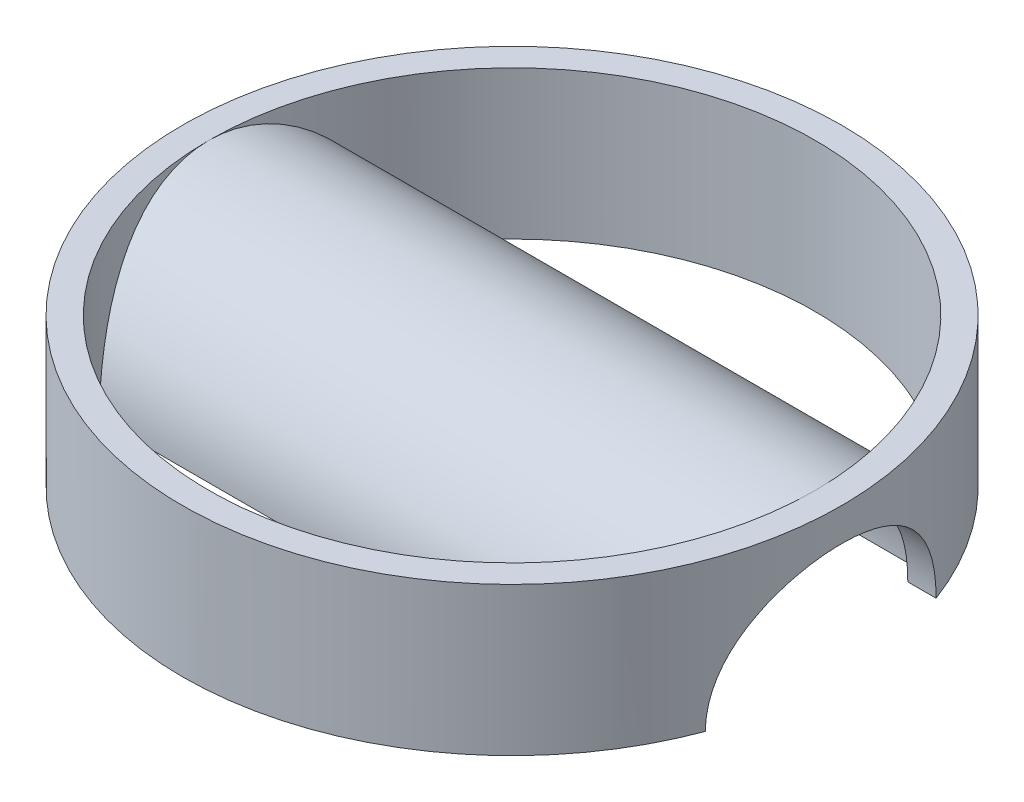
ISO-10303-21;
HEADER;
FILE_DESCRIPTION(('STEP AP214'),'2;1');
FILE_NAME('part.step','',(''),(''),'','','');
FILE_SCHEMA(('AUTOMOTIVE_DESIGN { 1 0 10303 214 1 1 1 1 }'));
ENDSEC;
DATA;
#1=APPLICATION_CONTEXT('core data for automotive mechanical design processes');
#2=APPLICATION_PROTOCOL_DEFINITION('international standard','automotive_design',2000,#1);
#3=PRODUCT_CONTEXT('',#1,'mechanical');
#4=PRODUCT('Part','Part','',(#3));
#5=PRODUCT_RELATED_PRODUCT_CATEGORY('part','',(#4));
#6=PRODUCT_DEFINITION_FORMATION('','',#4);
#7=PRODUCT_DEFINITION_CONTEXT('part definition',#1,'design');
#8=PRODUCT_DEFINITION('design','',#6,#7);
#9=PRODUCT_DEFINITION_SHAPE('','',#8);
#10=(LENGTH_UNIT() NAMED_UNIT(*) SI_UNIT(.MILLI.,.METRE.));
#11=(NAMED_UNIT(*) PLANE_ANGLE_UNIT() SI_UNIT($,.RADIAN.));
#12=(NAMED_UNIT(*) SI_UNIT($,.STERADIAN.) SOLID_ANGLE_UNIT());
#13=UNCERTAINTY_MEASURE_WITH_UNIT(LENGTH_MEASURE(1.E-05),#10,'distance_accuracy_value','');
#14=(GEOMETRIC_REPRESENTATION_CONTEXT(3) GLOBAL_UNCERTAINTY_ASSIGNED_CONTEXT((#13)) GLOBAL_UNIT_ASSIGNED_CONTEXT((#10,
#11,#12)) REPRESENTATION_CONTEXT('',''));
#15=CARTESIAN_POINT('',(0.,0.,0.));
#16=DIRECTION('',(0.,0.,1.));
#17=DIRECTION('',(1.,0.,0.));
#18=AXIS2_PLACEMENT_3D('',#15,#16,#17);
#19=CARTESIAN_POINT('',(0.,0.,0.));
#20=DIRECTION('',(0.,-1.,0.));
#21=DIRECTION('',(0.,0.,-1.));
#22=AXIS2_PLACEMENT_3D('',#19,#20,#21);
#23=PLANE('',#22);
#24=DIRECTION('',(1.,0.,0.));
#25=VECTOR('',#24,1.);
#26=CARTESIAN_POINT('',(0.,0.,2.25));
#27=LINE('',#26,#25);
#28=CARTESIAN_POINT('',(0.987831010538065,0.,2.25));
#29=VERTEX_POINT('',#28);
#30=CARTESIAN_POINT('',(9.01216898946194,0.,2.25));
#31=VERTEX_POINT('',#30);
#32=EDGE_CURVE('E237',#29,#31,#27,.T.);
#33=ORIENTED_EDGE('',*,*,#32,.F.);
#34=CARTESIAN_POINT('',(5.,0.,0.));
#35=DIRECTION('',(0.,-1.,0.));
#36=DIRECTION('',(0.,0.,-1.));
#37=AXIS2_PLACEMENT_3D('',#34,#35,#36);
#38=CIRCLE('',#37,4.6);
#39=EDGE_CURVE('E70',#31,#29,#38,.T.);
#40=ORIENTED_EDGE('',*,*,#39,.F.);
#41=EDGE_LOOP('',(#33,#40));
#42=FACE_BOUND('',#41,.T.);
#43=CARTESIAN_POINT('',(5.,0.,0.));
#44=DIRECTION('',(0.,-1.,0.));
#45=DIRECTION('',(0.,0.,-1.));
#46=AXIS2_PLACEMENT_3D('',#43,#44,#45);
#47=CIRCLE('',#46,5.);
#48=CARTESIAN_POINT('',(9.6837484987988,0.,1.75));
#49=VERTEX_POINT('',#48);
#50=CARTESIAN_POINT('',(0.3162515012012,0.,1.75));
#51=VERTEX_POINT('',#50);
#52=EDGE_CURVE('E126',#49,#51,#47,.T.);
#53=ORIENTED_EDGE('',*,*,#52,.T.);
#54=DIRECTION('',(-1.,0.,0.));
#55=VECTOR('',#54,1.);
#56=CARTESIAN_POINT('',(10.,0.,1.75));
#57=LINE('',#56,#55);
#58=CARTESIAN_POINT('',(0.745884345718842,0.,1.75));
#59=VERTEX_POINT('',#58);
#60=EDGE_CURVE('E162',#59,#51,#57,.T.);
#61=ORIENTED_EDGE('',*,*,#60,.F.);
#62=CARTESIAN_POINT('',(0.857536964558404,0.,2.));
#63=VERTEX_POINT('',#62);
#64=EDGE_CURVE('E158',#63,#59,#38,.T.);
#65=ORIENTED_EDGE('',*,*,#64,.F.);
#66=DIRECTION('',(-1.,0.,0.));
#67=VECTOR('',#66,1.);
#68=CARTESIAN_POINT('',(0.,0.,2.));
#69=LINE('',#68,#67);
#70=CARTESIAN_POINT('',(9.1424630354416,0.,2.));
#71=VERTEX_POINT('',#70);
#72=EDGE_CURVE('E265',#71,#63,#69,.T.);
#73=ORIENTED_EDGE('',*,*,#72,.F.);
#74=CARTESIAN_POINT('',(9.25411565428116,0.,1.75));
#75=VERTEX_POINT('',#74);
#76=EDGE_CURVE('E160',#75,#71,#38,.T.);
#77=ORIENTED_EDGE('',*,*,#76,.F.);
#78=EDGE_CURVE('E165',#49,#75,#57,.T.);
#79=ORIENTED_EDGE('',*,*,#78,.F.);
#80=EDGE_LOOP('',(#53,#61,#65,#73,#77,#79));
#81=FACE_BOUND('',#80,.T.);
#82=ADVANCED_FACE('F41',(#42,#81),#23,.T.);
#83=CARTESIAN_POINT('',(0.987831010538064,0.,-2.25));
#84=VERTEX_POINT('',#83);
#85=CARTESIAN_POINT('',(9.01216898946194,0.,-2.25));
#86=VERTEX_POINT('',#85);
#87=EDGE_CURVE('E159',#84,#86,#38,.T.);
#88=ORIENTED_EDGE('',*,*,#87,.F.);
#89=DIRECTION('',(1.,0.,0.));
#90=VECTOR('',#89,1.);
#91=CARTESIAN_POINT('',(0.,0.,-2.25));
#92=LINE('',#91,#90);
#93=EDGE_CURVE('E261',#84,#86,#92,.T.);
#94=ORIENTED_EDGE('',*,*,#93,.T.);
#95=EDGE_LOOP('',(#88,#94));
#96=FACE_BOUND('',#95,.T.);
#97=CARTESIAN_POINT('',(0.3162515012012,0.,-1.75));
#98=VERTEX_POINT('',#97);
#99=CARTESIAN_POINT('',(9.6837484987988,0.,-1.75));
#100=VERTEX_POINT('',#99);
#101=EDGE_CURVE('E124',#98,#100,#47,.T.);
#102=ORIENTED_EDGE('',*,*,#101,.T.);
#103=DIRECTION('',(-1.,0.,0.));
#104=VECTOR('',#103,1.);
#105=CARTESIAN_POINT('',(10.,0.,-1.75));
#106=LINE('',#105,#104);
#107=CARTESIAN_POINT('',(9.25411565428116,0.,-1.75));
#108=VERTEX_POINT('',#107);
#109=EDGE_CURVE('E133',#108,#100,#106,.F.);
#110=ORIENTED_EDGE('',*,*,#109,.F.);
#111=CARTESIAN_POINT('',(9.1424630354416,0.,-2.));
#112=VERTEX_POINT('',#111);
#113=EDGE_CURVE('E150',#112,#108,#38,.T.);
#114=ORIENTED_EDGE('',*,*,#113,.F.);
#115=DIRECTION('',(-1.,0.,0.));
#116=VECTOR('',#115,1.);
#117=CARTESIAN_POINT('',(0.,0.,-2.));
#118=LINE('',#117,#116);
#119=CARTESIAN_POINT('',(0.857536964558404,0.,-2.));
#120=VERTEX_POINT('',#119);
#121=EDGE_CURVE('E259',#112,#120,#118,.T.);
#122=ORIENTED_EDGE('',*,*,#121,.T.);
#123=CARTESIAN_POINT('',(0.745884345718842,0.,-1.75));
#124=VERTEX_POINT('',#123);
#125=EDGE_CURVE('E156',#124,#120,#38,.T.);
#126=ORIENTED_EDGE('',*,*,#125,.F.);
#127=EDGE_CURVE('E139',#98,#124,#106,.F.);
#128=ORIENTED_EDGE('',*,*,#127,.F.);
#129=EDGE_LOOP('',(#102,#110,#114,#122,#126,#128));
#130=FACE_BOUND('',#129,.T.);
#131=ADVANCED_FACE('F143',(#96,#130),#23,.T.);
#132=CARTESIAN_POINT('',(5.,2.25000000000002,0.));
#133=DIRECTION('',(0.,-1.,0.));
#134=DIRECTION('',(0.,0.,-1.));
#135=AXIS2_PLACEMENT_3D('',#132,#133,#134);
#136=CYLINDRICAL_SURFACE('',#135,4.6);
#137=ORIENTED_EDGE('',*,*,#87,.T.);
#138=CARTESIAN_POINT('',(9.01216898946194,0.,-2.25));
#139=CARTESIAN_POINT('',(9.01215226191571,0.0591193383603363,-2.25001042091816));
#140=CARTESIAN_POINT('',(9.01347524966883,0.118229418382301,-2.24767028754575));
#141=CARTESIAN_POINT('',(9.01867482733421,0.235938482673774,-2.23837085287397));
#142=CARTESIAN_POINT('',(9.02254992563146,0.294537745239158,-2.2314142497138));
#143=CARTESIAN_POINT('',(9.03270010210392,0.410482121911755,-2.21301451731746));
#144=CARTESIAN_POINT('',(9.03896182705205,0.467832370207593,-2.20159634188049));
#145=CARTESIAN_POINT('',(9.05365639005365,0.581200328382831,-2.17442129956309));
#146=CARTESIAN_POINT('',(9.06208946212052,0.637217893923238,-2.15866396502417));
#147=CARTESIAN_POINT('',(9.09020467906264,0.802501187165457,-2.10519751557872));
#148=CARTESIAN_POINT('',(9.11273477268241,0.909332933078639,-2.06123961045431));
#149=CARTESIAN_POINT('',(9.16280751266454,1.11417893658202,-1.9581384311416));
#150=CARTESIAN_POINT('',(9.19035755440456,1.21217986198981,-1.89897269929243));
#151=CARTESIAN_POINT('',(9.2499802568094,1.40494632765788,-1.76172776360235));
#152=CARTESIAN_POINT('',(9.28223808329457,1.49886193986463,-1.68253257833878));
#153=CARTESIAN_POINT('',(9.34613968950891,1.67271542726402,-1.50981718461198));
#154=CARTESIAN_POINT('',(9.37778330598169,1.7526496302453,-1.41629322476564));
#155=CARTESIAN_POINT('',(9.4393202700427,1.90129803894811,-1.21024948185522));
#156=CARTESIAN_POINT('',(9.46897233522057,1.96896803792398,-1.09689746100613));
#157=CARTESIAN_POINT('',(9.52078028545692,2.08388924581036,-0.858696533492306));
#158=CARTESIAN_POINT('',(9.5429406599695,2.13115268823275,-0.733854569540401));
#159=CARTESIAN_POINT('',(9.57592743140304,2.20056293760628,-0.485294244296741));
#160=CARTESIAN_POINT('',(9.58742701934264,2.22421024947974,-0.362086239526088));
#161=CARTESIAN_POINT('',(9.60030053914536,2.250645913304,-0.112953071646674));
#162=CARTESIAN_POINT('',(9.60168012911833,2.25344592103484,0.0129705336578172));
#163=CARTESIAN_POINT('',(9.59448785151615,2.23871481660233,0.252731499616454));
#164=CARTESIAN_POINT('',(9.58673543126909,2.22285798801819,0.366701816096554));
#165=CARTESIAN_POINT('',(9.56337338226351,2.17424234046734,0.590120373104213));
#166=CARTESIAN_POINT('',(9.54776331813399,2.14148258495224,0.699568362698115));
#167=CARTESIAN_POINT('',(9.50984709724638,2.05974421006981,0.912789003035313));
#168=CARTESIAN_POINT('',(9.48744856656678,2.01054081994078,1.01645838032306));
#169=CARTESIAN_POINT('',(9.43799774633117,1.89760348124523,1.2143280573401));
#170=CARTESIAN_POINT('',(9.41094369835941,1.83386403935843,1.30852475780742));
#171=CARTESIAN_POINT('',(9.35182841638748,1.68696115132252,1.49395575048974));
#172=CARTESIAN_POINT('',(9.31953553410854,1.60255483921451,1.58413239241832));
#173=CARTESIAN_POINT('',(9.25520063541857,1.42004344186009,1.74961919526835));
#174=CARTESIAN_POINT('',(9.22315884994185,1.32192702389467,1.82491693175759));
#175=CARTESIAN_POINT('',(9.16092332190671,1.10765480788556,1.96285101194141));
#176=CARTESIAN_POINT('',(9.130952499316,0.990773557722026,2.02446924266621));
#177=CARTESIAN_POINT('',(9.07930871301415,0.746577778835449,2.12662828219894));
#178=CARTESIAN_POINT('',(9.05761666065931,0.619288082975609,2.16721765623501));
#179=CARTESIAN_POINT('',(9.03218753484405,0.409039302224487,2.21401818021354));
#180=CARTESIAN_POINT('',(9.02474879870154,0.328079038133764,2.227459499189));
#181=CARTESIAN_POINT('',(9.01471032720756,0.1647731989111,2.24546982746328));
#182=CARTESIAN_POINT('',(9.01211733436697,0.082425854159989,2.250026474748));
#183=CARTESIAN_POINT('',(9.01216898946194,0.,2.25));
#184=B_SPLINE_CURVE_WITH_KNOTS('',3,(#138,#139,#140,#141,#142,#143,#144,#145,#146,#147,#148,
#149,#150,#151,#152,#153,#154,#155,#156,#157,#158,#159,#160,#161,#162,#163,#164,#165,#166,#167,
#168,#169,#170,#171,#172,#173,#174,#175,#176,#177,#178,#179,#180,#181,#182,#183),.UNSPECIFIED.,
.F.,.F.,(4,2,2,2,2,2,2,2,2,2,2,2,2,2,2,2,2,2,2,2,2,2,4),(0.,0.177281719720692,0.354459916620579,
0.530661013766885,0.706881108652787,1.05831031020711,1.41026148508282,1.78969011955156,
2.16921826163491,2.5730134903365,2.97656631087889,3.35243706269682,3.72809764844285,
4.07246324446721,4.41684792296692,4.76614693789848,5.11557817583227,5.49694692167357,
5.87863279101331,6.28299696075667,6.68642305885193,6.93305055626975,7.18002096372402),.UNSPECIFIED.);
#185=CARTESIAN_POINT('',(9.6,2.25000000000002,0.));
#186=VERTEX_POINT('',#185);
#187=EDGE_CURVE('E204',#86,#186,#184,.T.);
#188=ORIENTED_EDGE('',*,*,#187,.T.);
#189=CARTESIAN_POINT('',(5.,2.25000000000002,0.));
#190=DIRECTION('',(0.,-1.,0.));
#191=DIRECTION('',(0.,0.,-1.));
#192=AXIS2_PLACEMENT_3D('',#189,#190,#191);
#193=CIRCLE('',#192,4.6);
#194=CARTESIAN_POINT('',(0.399999999999999,2.25000000000002,0.));
#195=VERTEX_POINT('',#194);
#196=EDGE_CURVE('E246',#195,#186,#193,.T.);
#197=ORIENTED_EDGE('',*,*,#196,.F.);
#198=CARTESIAN_POINT('',(0.987831010538065,0.,2.25));
#199=CARTESIAN_POINT('',(0.987847738084289,0.0591193383603199,2.25001042091816));
#200=CARTESIAN_POINT('',(0.986524750331168,0.118229418382285,2.24767028754575));
#201=CARTESIAN_POINT('',(0.981325172665783,0.235938482673758,2.23837085287397));
#202=CARTESIAN_POINT('',(0.977450074368537,0.294537745239142,2.2314142497138));
#203=CARTESIAN_POINT('',(0.967299897896081,0.41048212191174,2.21301451731746));
#204=CARTESIAN_POINT('',(0.961038172947954,0.467832370207578,2.20159634188049));
#205=CARTESIAN_POINT('',(0.946343609946346,0.581200328382815,2.1744212995631));
#206=CARTESIAN_POINT('',(0.937910537879478,0.637217893923223,2.15866396502417));
#207=CARTESIAN_POINT('',(0.90979532093736,0.802501187165443,2.10519751557873));
#208=CARTESIAN_POINT('',(0.887265227317587,0.909332933078626,2.06123961045432));
#209=CARTESIAN_POINT('',(0.837192487335454,1.11417893658201,1.95813843114161));
#210=CARTESIAN_POINT('',(0.809642445595437,1.2121798619898,1.89897269929244));
#211=CARTESIAN_POINT('',(0.750019743190595,1.40494632765787,1.76172776360236));
#212=CARTESIAN_POINT('',(0.717761916705421,1.49886193986462,1.68253257833879));
#213=CARTESIAN_POINT('',(0.65386031049109,1.67271542726401,1.50981718461199));
#214=CARTESIAN_POINT('',(0.62221669401831,1.7526496302453,1.41629322476565));
#215=CARTESIAN_POINT('',(0.560679729957296,1.9012980389481,1.21024948185523));
#216=CARTESIAN_POINT('',(0.531027664779423,1.96896803792398,1.09689746100614));
#217=CARTESIAN_POINT('',(0.47921971454308,2.08388924581035,0.858696533492318));
#218=CARTESIAN_POINT('',(0.457059340030498,2.13115268823274,0.733854569540413));
#219=CARTESIAN_POINT('',(0.424072568596959,2.20056293760628,0.485294244296754));
#220=CARTESIAN_POINT('',(0.412572980657356,2.22421024947973,0.362086239526101));
#221=CARTESIAN_POINT('',(0.399699460854644,2.250645913304,0.112953071646687));
#222=CARTESIAN_POINT('',(0.398319870881667,2.25344592103484,-0.0129705336578033));
#223=CARTESIAN_POINT('',(0.40551214848385,2.23871481660234,-0.252731499616439));
#224=CARTESIAN_POINT('',(0.413264568730909,2.22285798801819,-0.36670181609654));
#225=CARTESIAN_POINT('',(0.436626617736495,2.17424234046734,-0.590120373104198));
#226=CARTESIAN_POINT('',(0.452236681866012,2.14148258495224,-0.699568362698101));
#227=CARTESIAN_POINT('',(0.490152902753628,2.05974421006981,-0.912789003035299));
#228=CARTESIAN_POINT('',(0.512551433433223,2.01054081994079,-1.01645838032304));
#229=CARTESIAN_POINT('',(0.56200225366883,1.89760348124524,-1.21432805734009));
#230=CARTESIAN_POINT('',(0.589056301640597,1.83386403935843,-1.30852475780741));
#231=CARTESIAN_POINT('',(0.648171583612529,1.68696115132253,-1.49395575048973));
#232=CARTESIAN_POINT('',(0.680464465891464,1.60255483921452,-1.58413239241831));
#233=CARTESIAN_POINT('',(0.744799364581429,1.4200434418601,-1.74961919526835));
#234=CARTESIAN_POINT('',(0.776841150058154,1.32192702389468,-1.82491693175758));
#235=CARTESIAN_POINT('',(0.839076678093291,1.10765480788557,-1.9628510119414));
#236=CARTESIAN_POINT('',(0.869047500684006,0.990773557722036,-2.0244692426662));
#237=CARTESIAN_POINT('',(0.920691286985848,0.746577778835461,-2.12662828219893));
#238=CARTESIAN_POINT('',(0.942383339340694,0.619288082975621,-2.167217656235));
#239=CARTESIAN_POINT('',(0.967812465155951,0.4090393022245,-2.21401818021354));
#240=CARTESIAN_POINT('',(0.975251201298464,0.328079038133777,-2.22745949918899));
#241=CARTESIAN_POINT('',(0.985289672792445,0.164773198911116,-2.24546982746327));
#242=CARTESIAN_POINT('',(0.987882665633029,0.0824258541600048,-2.250026474748));
#243=CARTESIAN_POINT('',(0.987831010538065,0.,-2.25));
#244=B_SPLINE_CURVE_WITH_KNOTS('',3,(#198,#199,#200,#201,#202,#203,#204,#205,#206,#207,#208,
#209,#210,#211,#212,#213,#214,#215,#216,#217,#218,#219,#220,#221,#222,#223,#224,#225,#226,#227,
#228,#229,#230,#231,#232,#233,#234,#235,#236,#237,#238,#239,#240,#241,#242,#243),.UNSPECIFIED.,
.F.,.F.,(4,2,2,2,2,2,2,2,2,2,2,2,2,2,2,2,2,2,2,2,2,2,4),(0.,0.177281719720692,0.35445991662058,
0.530661013766886,0.706881108652788,1.05831031020711,1.41026148508283,1.78969011955157,
2.16921826163492,2.5730134903365,2.9765663108789,3.35243706269682,3.72809764844286,
4.07246324446721,4.41684792296693,4.76614693789849,5.11557817583228,5.49694692167357,
5.87863279101332,6.28299696075667,6.68642305885193,6.93305055626975,7.18002096372402),.UNSPECIFIED.);
#245=EDGE_CURVE('E185',#195,#84,#244,.T.);
#246=ORIENTED_EDGE('',*,*,#245,.T.);
#247=EDGE_LOOP('',(#137,#188,#197,#246));
#248=FACE_BOUND('',#247,.T.);
#249=ADVANCED_FACE('F176',(#248),#136,.F.);
#250=EDGE_CURVE('E140',#186,#195,#193,.T.);
#251=ORIENTED_EDGE('',*,*,#250,.F.);
#252=EDGE_CURVE('E193',#186,#31,#184,.T.);
#253=ORIENTED_EDGE('',*,*,#252,.T.);
#254=ORIENTED_EDGE('',*,*,#39,.T.);
#255=EDGE_CURVE('E274',#29,#195,#244,.T.);
#256=ORIENTED_EDGE('',*,*,#255,.T.);
#257=EDGE_LOOP('',(#251,#253,#254,#256));
#258=FACE_BOUND('',#257,.T.);
#259=ADVANCED_FACE('F285',(#258),#136,.F.);
#260=ORIENTED_EDGE('',*,*,#76,.T.);
#261=CARTESIAN_POINT('',(9.1424630354416,0.,2.));
#262=CARTESIAN_POINT('',(9.14246806311185,0.106175152213515,1.99999530311751));
#263=CARTESIAN_POINT('',(9.14660399038578,0.212528347322527,1.99149155896143));
#264=CARTESIAN_POINT('',(9.1625946322044,0.422122789743843,1.9578397975293));
#265=CARTESIAN_POINT('',(9.17446942285977,0.525355210271091,1.93264848666684));
#266=CARTESIAN_POINT('',(9.20432179483748,0.725301560364742,1.86680645653016));
#267=CARTESIAN_POINT('',(9.22227295888263,0.822041570479978,1.82622256661147));
#268=CARTESIAN_POINT('',(9.2622153266006,1.00731390119094,1.7309474538946));
#269=CARTESIAN_POINT('',(9.28420582327564,1.09584765404063,1.67625869917197));
#270=CARTESIAN_POINT('',(9.33141707323708,1.26825540374419,1.55035828339539));
#271=CARTESIAN_POINT('',(9.35675336954986,1.35150630903776,1.47833626573371));
#272=CARTESIAN_POINT('',(9.40685593818728,1.50521350665962,1.32151228350938));
#273=CARTESIAN_POINT('',(9.4316219755083,1.57566460377287,1.23670515513727));
#274=CARTESIAN_POINT('',(9.4792194065118,1.70505218211538,1.05172759931953));
#275=CARTESIAN_POINT('',(9.50190100959082,1.76327420725275,0.951015352407976));
#276=CARTESIAN_POINT('',(9.5413431504715,1.86167612729061,0.740059775682963));
#277=CARTESIAN_POINT('',(9.55810653773684,1.9018647073487,0.629821064521891));
#278=CARTESIAN_POINT('',(9.58300166972325,1.96075896869638,0.409496803187521));
#279=CARTESIAN_POINT('',(9.59156466456272,1.98054278763174,0.299749194225163));
#280=CARTESIAN_POINT('',(9.60066949767696,2.00156329924627,0.0781808581979216));
#281=CARTESIAN_POINT('',(9.60121489788946,2.00280822811106,-0.0336389261626699));
#282=CARTESIAN_POINT('',(9.5944672205797,1.98725081151937,-0.248285618766573));
#283=CARTESIAN_POINT('',(9.5876903357199,1.97163699288649,-0.351218054474396));
#284=CARTESIAN_POINT('',(9.56778311284747,1.92486067378227,-0.552831686497816));
#285=CARTESIAN_POINT('',(9.55465230486356,1.8936970231541,-0.651512567756874));
#286=CARTESIAN_POINT('',(9.52303970517703,1.8163558594895,-0.843649712167159));
#287=CARTESIAN_POINT('',(9.5044791349828,1.76995597993599,-0.937002968050662));
#288=CARTESIAN_POINT('',(9.46379406341641,1.6636899188872,-1.11484396784575));
#289=CARTESIAN_POINT('',(9.44166827390979,1.60381886706833,-1.19932848914277));
#290=CARTESIAN_POINT('',(9.39406568656005,1.4670468368057,-1.36384233103048));
#291=CARTESIAN_POINT('',(9.36846200903427,1.38919920246959,-1.44304899634184));
#292=CARTESIAN_POINT('',(9.31801099850211,1.22132053480878,-1.58765829853272));
#293=CARTESIAN_POINT('',(9.29316401544564,1.13128396619108,-1.65305462905923));
#294=CARTESIAN_POINT('',(9.24608617223059,0.937243279459384,-1.77057103743728));
#295=CARTESIAN_POINT('',(9.22399260864159,0.832835261679365,-1.82208407125543));
#296=CARTESIAN_POINT('',(9.18659620049954,0.615613619088706,-1.90645396367255));
#297=CARTESIAN_POINT('',(9.17128800391885,0.502806701325285,-1.93932553165755));
#298=CARTESIAN_POINT('',(9.15055797118611,0.280253667320439,-1.98328606053446));
#299=CARTESIAN_POINT('',(9.14452865477185,0.170830546976165,-1.99571753476307));
#300=CARTESIAN_POINT('',(9.1412978270933,-0.0486810363801587,-2.00241696852022));
#301=CARTESIAN_POINT('',(9.14409277950984,-0.15876921522159,-1.99669220414372));
#302=CARTESIAN_POINT('',(9.15756357519993,-0.368065014525704,-1.96846936433846));
#303=CARTESIAN_POINT('',(9.16765401027538,-0.467483220869257,-1.94721606948348));
#304=CARTESIAN_POINT('',(9.19380633698488,-0.661241340001427,-1.89022850580754));
#305=CARTESIAN_POINT('',(9.20986970947324,-0.755579986782782,-1.85449064566934));
#306=CARTESIAN_POINT('',(9.24701438959494,-0.941153712506054,-1.7678172591703));
#307=CARTESIAN_POINT('',(9.2682854220213,-1.03206948618006,-1.71628210917469));
#308=CARTESIAN_POINT('',(9.31320051172397,-1.20442349242039,-1.60005610718941));
#309=CARTESIAN_POINT('',(9.33684565389904,-1.28585735498398,-1.53535922668905));
#310=CARTESIAN_POINT('',(9.38641453751167,-1.44458430839867,-1.38778544546639));
#311=CARTESIAN_POINT('',(9.412351577144,-1.52084274040164,-1.30379556353977));
#312=CARTESIAN_POINT('',(9.46163111575775,-1.65839755167602,-1.1236374767173));
#313=CARTESIAN_POINT('',(9.48497331484138,-1.71969220249078,-1.02746786689572));
#314=CARTESIAN_POINT('',(9.52668606891059,-1.82572808428391,-0.824556805603411));
#315=CARTESIAN_POINT('',(9.54502456017467,-1.87036320165056,-0.717752895895001));
#316=CARTESIAN_POINT('',(9.57440691925551,-1.94067740282899,-0.497141971275311));
#317=CARTESIAN_POINT('',(9.58545555685257,-1.96636888283445,-0.383339588894902));
#318=CARTESIAN_POINT('',(9.59842090409752,-1.99640651243888,-0.161165899464224));
#319=CARTESIAN_POINT('',(9.6009597548307,-2.00220763164285,-0.0530264590520763));
#320=CARTESIAN_POINT('',(9.59838690965581,-1.99628946756613,0.16266655316553));
#321=CARTESIAN_POINT('',(9.59327677594966,-1.98457376186126,0.270220240100884));
#322=CARTESIAN_POINT('',(9.57632104483087,-1.9449968805077,0.477103829793295));
#323=CARTESIAN_POINT('',(9.56476116544688,-1.91781969173782,0.576590026892768));
#324=CARTESIAN_POINT('',(9.53622577190859,-1.84887159271505,0.769529124527719));
#325=CARTESIAN_POINT('',(9.51924927885239,-1.80709804444721,0.86298093084192));
#326=CARTESIAN_POINT('',(9.4805339659563,-1.70802676308519,1.04592438264821));
#327=CARTESIAN_POINT('',(9.45861277599899,-1.65010613644357,1.13503914687413));
#328=CARTESIAN_POINT('',(9.4125515914946,-1.52125906349677,1.30267346461881));
#329=CARTESIAN_POINT('',(9.38841069556962,-1.450327321903,1.38118868164606));
#330=CARTESIAN_POINT('',(9.33833207570661,-1.29121761594745,1.53154092060296));
#331=CARTESIAN_POINT('',(9.31239544526379,-1.20214494776314,1.60243479209411));
#332=CARTESIAN_POINT('',(9.26345442459961,-1.01262388146713,1.72845083012102));
#333=CARTESIAN_POINT('',(9.24045178937292,-0.912168742034061,1.7835635813498));
#334=CARTESIAN_POINT('',(9.2003086349293,-0.702277458400498,1.87615819336783));
#335=CARTESIAN_POINT('',(9.18316978114197,-0.592838773620883,1.91363504634684));
#336=CARTESIAN_POINT('',(9.15733137372799,-0.368389705616246,1.96915264800439));
#337=CARTESIAN_POINT('',(9.14860351848983,-0.253399384211109,1.98725859936658));
#338=CARTESIAN_POINT('',(9.14399025971766,-0.114851615365163,1.9968329987511));
#339=CARTESIAN_POINT('',(9.14341870676231,-0.0919035207137795,1.99801951623504));
#340=CARTESIAN_POINT('',(9.14265454646599,-0.0459730671700044,1.99960353334146));
#341=CARTESIAN_POINT('',(9.14246194677166,-0.0229907075955698,2.00000101704259));
#342=CARTESIAN_POINT('',(9.1424630354416,0.,2.));
#343=B_SPLINE_CURVE_WITH_KNOTS('',3,(#261,#262,#263,#264,#265,#266,#267,#268,#269,#270,#271,
#272,#273,#274,#275,#276,#277,#278,#279,#280,#281,#282,#283,#284,#285,#286,#287,#288,#289,#290,
#291,#292,#293,#294,#295,#296,#297,#298,#299,#300,#301,#302,#303,#304,#305,#306,#307,#308,#309,
#310,#311,#312,#313,#314,#315,#316,#317,#318,#319,#320,#321,#322,#323,#324,#325,#326,#327,#328,
#329,#330,#331,#332,#333,#334,#335,#336,#337,#338,#339,#340,#341,#342),.UNSPECIFIED.,.T.,.F.,(4,
2,2,2,2,2,2,2,2,2,2,2,2,2,2,2,2,2,2,2,2,2,2,2,2,2,2,2,2,2,2,2,2,2,2,2,2,2,2,2,4),(0.,
0.318428625191217,0.637686621936556,0.955574088029287,1.27340596772481,1.61081841354016,
1.94836750461647,2.30210852036036,2.6556789861809,2.98942604364586,3.32302482444764,
3.63455329960704,3.94610482065709,4.26242196146309,4.57885364681527,4.91926230039246,
5.25982606369487,5.61348245749554,5.96685940263917,6.29593495556254,6.62487864844418,
6.92999962305467,7.23519629598215,7.55382453000134,7.87259903627943,8.22010350106513,
8.56764808689365,8.91737005174371,9.26686296459848,9.59017219018092,9.91341539322313,
10.2233616288063,10.5333639102877,10.8575513589945,11.1818710400522,11.5305259020817,
11.8793883466613,12.2283497929636,12.576132899237,12.6450826632875,12.7140338186116),.UNSPECIFIED.);
#344=EDGE_CURVE('E146',#71,#112,#343,.T.);
#345=ORIENTED_EDGE('',*,*,#344,.T.);
#346=ORIENTED_EDGE('',*,*,#113,.T.);
#347=CARTESIAN_POINT('',(9.25411565428116,0.,-1.75));
#348=CARTESIAN_POINT('',(9.25410992287369,0.0473019743762563,-1.75000180814593));
#349=CARTESIAN_POINT('',(9.25490558283974,0.0945792475449949,-1.7480809235611));
#350=CARTESIAN_POINT('',(9.25804217343128,0.18875711047749,-1.74043172627651));
#351=CARTESIAN_POINT('',(9.26038257065395,0.235657824612073,-1.73470472783556));
#352=CARTESIAN_POINT('',(9.269607776033,0.37493488988312,-1.71193790226351));
#353=CARTESIAN_POINT('',(9.27869763509534,0.46631695227543,-1.68931143853315));
#354=CARTESIAN_POINT('',(9.30162397394134,0.643601449706651,-1.63003806317024));
#355=CARTESIAN_POINT('',(9.31545625709267,0.729508650085148,-1.59340354415402));
#356=CARTESIAN_POINT('',(9.34629557692409,0.894050664311445,-1.50725044448465));
#357=CARTESIAN_POINT('',(9.3633052978843,0.972679244606584,-1.45772095620734));
#358=CARTESIAN_POINT('',(9.39954768401237,1.12436733739075,-1.34449496972005));
#359=CARTESIAN_POINT('',(9.41884679709259,1.19700066155125,-1.2802488750058));
#360=CARTESIAN_POINT('',(9.45694032631125,1.33076456720752,-1.14057803936638));
#361=CARTESIAN_POINT('',(9.47573464293148,1.39189289461178,-1.06515111302495));
#362=CARTESIAN_POINT('',(9.51149900156477,1.50299437682344,-0.901988679150384));
#363=CARTESIAN_POINT('',(9.52838156767409,1.55249925422428,-0.813913423186256));
#364=CARTESIAN_POINT('',(9.55761390491121,1.63580965770043,-0.629930851531691));
#365=CARTESIAN_POINT('',(9.56996540834298,1.66962118493015,-0.53402654620266));
#366=CARTESIAN_POINT('',(9.58827016749172,1.71907766154115,-0.341610566472286));
#367=CARTESIAN_POINT('',(9.59448242297448,1.73546045516269,-0.245313661631263));
#368=CARTESIAN_POINT('',(9.600739711171,1.75196124192706,-0.0511486653056569));
#369=CARTESIAN_POINT('',(9.60078670178377,1.7520843986319,0.0467189175054196));
#370=CARTESIAN_POINT('',(9.59487114268516,1.73648608360848,0.235946705608964));
#371=CARTESIAN_POINT('',(9.58921433296575,1.72157072146491,0.327384593837916));
#372=CARTESIAN_POINT('',(9.57293027285103,1.67767828044786,0.506345712265975));
#373=CARTESIAN_POINT('',(9.56230274017342,1.64870040297493,0.59386871983368));
#374=CARTESIAN_POINT('',(9.53693181279757,1.57714360687683,0.764045980330548));
#375=CARTESIAN_POINT('',(9.52213023687997,1.53437110008071,0.846609799509263));
#376=CARTESIAN_POINT('',(9.48990287248052,1.43661203015296,1.00359539017313));
#377=CARTESIAN_POINT('',(9.47247621528079,1.38162142081379,1.07801445218585));
#378=CARTESIAN_POINT('',(9.43555530040169,1.2571353003525,1.22133185256725));
#379=CARTESIAN_POINT('',(9.41599972206181,1.18696766547039,1.28963141193855));
#380=CARTESIAN_POINT('',(9.37785132513865,1.03605195005326,1.4137338594285));
#381=CARTESIAN_POINT('',(9.35925889901238,0.95529960313389,1.46953168376452));
#382=CARTESIAN_POINT('',(9.32474262259859,0.783057680793006,1.56825032015716));
#383=CARTESIAN_POINT('',(9.30889328545735,0.691357391875872,1.61083100121302));
#384=CARTESIAN_POINT('',(9.28253290966555,0.501372358841491,1.67966985119265));
#385=CARTESIAN_POINT('',(9.27201281165672,0.403099112538325,1.70595573734095));
#386=CARTESIAN_POINT('',(9.26134932571395,0.253187024663225,1.73233442255356));
#387=CARTESIAN_POINT('',(9.25864760239432,0.202797541249276,1.73895229673954));
#388=CARTESIAN_POINT('',(9.25502770509509,0.101615376057461,1.74778439807952));
#389=CARTESIAN_POINT('',(9.25410798245756,0.0508230829301556,1.75000244896513));
#390=CARTESIAN_POINT('',(9.25411565428116,0.,1.75));
#391=B_SPLINE_CURVE_WITH_KNOTS('',3,(#347,#348,#349,#350,#351,#352,#353,#354,#355,#356,#357,
#358,#359,#360,#361,#362,#363,#364,#365,#366,#367,#368,#369,#370,#371,#372,#373,#374,#375,#376,
#377,#378,#379,#380,#381,#382,#383,#384,#385,#386,#387,#388,#389,#390),.UNSPECIFIED.,.F.,.F.,(4,
2,2,2,2,2,2,2,2,2,2,2,2,2,2,2,2,2,2,2,2,4),(0.,0.1418123252954,0.283575707932379,
0.565827632132784,0.847830429876812,1.1300725481882,1.42537775790837,1.72074076456962,
2.02649815851778,2.33213853397464,2.62425073232596,2.91627016457895,3.19342696840398,
3.47059951359327,3.7518446406576,4.03318304544681,4.33139449096918,4.62972650847034,
4.93519822051994,5.24014889324013,5.39263457102136,5.54498767070493),.UNSPECIFIED.);
#392=EDGE_CURVE('E55',#108,#75,#391,.T.);
#393=ORIENTED_EDGE('',*,*,#392,.T.);
#394=EDGE_LOOP('',(#260,#345,#346,#393));
#395=FACE_BOUND('',#394,.T.);
#396=ADVANCED_FACE('F175',(#395),#136,.F.);
#397=ORIENTED_EDGE('',*,*,#125,.T.);
#398=CARTESIAN_POINT('',(0.857536964558403,0.,2.));
#399=CARTESIAN_POINT('',(0.857531936888153,-0.106175152213515,1.99999530311751));
#400=CARTESIAN_POINT('',(0.853396009614222,-0.212528347322526,1.99149155896143));
#401=CARTESIAN_POINT('',(0.837405367795608,-0.422122789743842,1.95783979752931));
#402=CARTESIAN_POINT('',(0.825530577140239,-0.525355210271089,1.93264848666684));
#403=CARTESIAN_POINT('',(0.79567820516252,-0.72530156036474,1.86680645653017));
#404=CARTESIAN_POINT('',(0.777727041117377,-0.822041570479976,1.82622256661147));
#405=CARTESIAN_POINT('',(0.73778467339941,-1.00731390119094,1.7309474538946));
#406=CARTESIAN_POINT('',(0.715794176724364,-1.09584765404063,1.67625869917197));
#407=CARTESIAN_POINT('',(0.66858292676293,-1.26825540374419,1.55035828339539));
#408=CARTESIAN_POINT('',(0.643246630450153,-1.35150630903776,1.47833626573371));
#409=CARTESIAN_POINT('',(0.593144061812726,-1.50521350665962,1.32151228350939));
#410=CARTESIAN_POINT('',(0.56837802449171,-1.57566460377287,1.23670515513727));
#411=CARTESIAN_POINT('',(0.520780593488207,-1.70505218211537,1.05172759931954));
#412=CARTESIAN_POINT('',(0.498098990409189,-1.76327420725274,0.951015352407983));
#413=CARTESIAN_POINT('',(0.458656849528507,-1.86167612729061,0.740059775682971));
#414=CARTESIAN_POINT('',(0.441893462263166,-1.9018647073487,0.629821064521899));
#415=CARTESIAN_POINT('',(0.416998330276758,-1.96075896869637,0.409496803187529));
#416=CARTESIAN_POINT('',(0.408435335437281,-1.98054278763174,0.299749194225171));
#417=CARTESIAN_POINT('',(0.399330502323035,-2.00156329924627,0.0781808581979277));
#418=CARTESIAN_POINT('',(0.398785102110544,-2.00280822811106,-0.0336389261626642));
#419=CARTESIAN_POINT('',(0.4055327794203,-1.98725081151937,-0.248285618766568));
#420=CARTESIAN_POINT('',(0.4123096642801,-1.97163699288649,-0.351218054474391));
#421=CARTESIAN_POINT('',(0.432216887152531,-1.92486067378227,-0.552831686497812));
#422=CARTESIAN_POINT('',(0.445347695136431,-1.8936970231541,-0.65151256775687));
#423=CARTESIAN_POINT('',(0.476960294822964,-1.8163558594895,-0.843649712167156));
#424=CARTESIAN_POINT('',(0.49552086501719,-1.76995597993599,-0.937002968050658));
#425=CARTESIAN_POINT('',(0.536205936583583,-1.66368991888721,-1.11484396784575));
#426=CARTESIAN_POINT('',(0.558331726090208,-1.60381886706833,-1.19932848914276));
#427=CARTESIAN_POINT('',(0.605934313439941,-1.46704683680571,-1.36384233103048));
#428=CARTESIAN_POINT('',(0.631537990965723,-1.3891992024696,-1.44304899634184));
#429=CARTESIAN_POINT('',(0.681989001497886,-1.22132053480879,-1.58765829853272));
#430=CARTESIAN_POINT('',(0.706835984554352,-1.13128396619108,-1.65305462905922));
#431=CARTESIAN_POINT('',(0.753913827769406,-0.937243279459391,-1.77057103743728));
#432=CARTESIAN_POINT('',(0.776007391358399,-0.832835261679371,-1.82208407125542));
#433=CARTESIAN_POINT('',(0.813403799500454,-0.615613619088713,-1.90645396367255));
#434=CARTESIAN_POINT('',(0.82871199608115,-0.502806701325293,-1.93932553165755));
#435=CARTESIAN_POINT('',(0.849442028813886,-0.280253667320446,-1.98328606053446));
#436=CARTESIAN_POINT('',(0.855471345228151,-0.170830546976172,-1.99571753476307));
#437=CARTESIAN_POINT('',(0.8587021729067,0.0486810363801541,-2.00241696852022));
#438=CARTESIAN_POINT('',(0.855907220490164,0.158769215221586,-1.99669220414372));
#439=CARTESIAN_POINT('',(0.842436424800072,0.368065014525701,-1.96846936433846));
#440=CARTESIAN_POINT('',(0.832345989724621,0.467483220869254,-1.94721606948348));
#441=CARTESIAN_POINT('',(0.806193663015125,0.661241340001425,-1.89022850580754));
#442=CARTESIAN_POINT('',(0.790130290526766,0.755579986782779,-1.85449064566934));
#443=CARTESIAN_POINT('',(0.752985610405066,0.941153712506051,-1.7678172591703));
#444=CARTESIAN_POINT('',(0.731714577978704,1.03206948618006,-1.71628210917469));
#445=CARTESIAN_POINT('',(0.686799488276036,1.20442349242038,-1.60005610718941));
#446=CARTESIAN_POINT('',(0.663154346100969,1.28585735498398,-1.53535922668906));
#447=CARTESIAN_POINT('',(0.613585462488332,1.44458430839866,-1.38778544546639));
#448=CARTESIAN_POINT('',(0.587648422856003,1.52084274040164,-1.30379556353977));
#449=CARTESIAN_POINT('',(0.538368884242258,1.65839755167602,-1.1236374767173));
#450=CARTESIAN_POINT('',(0.51502668515863,1.71969220249078,-1.02746786689572));
#451=CARTESIAN_POINT('',(0.47331393108942,1.82572808428391,-0.824556805603418));
#452=CARTESIAN_POINT('',(0.454975439825333,1.87036320165055,-0.717752895895008));
#453=CARTESIAN_POINT('',(0.42559308074449,1.94067740282899,-0.497141971275318));
#454=CARTESIAN_POINT('',(0.414544443147429,1.96636888283445,-0.383339588894908));
#455=CARTESIAN_POINT('',(0.401579095902481,1.99640651243888,-0.16116589946423));
#456=CARTESIAN_POINT('',(0.399040245169301,2.00220763164285,-0.0530264590520824));
#457=CARTESIAN_POINT('',(0.401613090344191,1.99628946756613,0.162666553165525));
#458=CARTESIAN_POINT('',(0.406723224050338,1.98457376186126,0.270220240100879));
#459=CARTESIAN_POINT('',(0.423678955169122,1.9449968805077,0.477103829793291));
#460=CARTESIAN_POINT('',(0.435238834553119,1.91781969173782,0.576590026892764));
#461=CARTESIAN_POINT('',(0.463774228091407,1.84887159271505,0.769529124527715));
#462=CARTESIAN_POINT('',(0.480750721147608,1.80709804444721,0.862980930841917));
#463=CARTESIAN_POINT('',(0.519466034043696,1.7080267630852,1.04592438264821));
#464=CARTESIAN_POINT('',(0.541387224001008,1.65010613644357,1.13503914687413));
#465=CARTESIAN_POINT('',(0.587448408505391,1.52125906349677,1.30267346461881));
#466=CARTESIAN_POINT('',(0.611589304430371,1.45032732190301,1.38118868164606));
#467=CARTESIAN_POINT('',(0.661667924293384,1.29121761594746,1.53154092060296));
#468=CARTESIAN_POINT('',(0.687604554736199,1.20214494776315,1.6024347920941));
#469=CARTESIAN_POINT('',(0.736545575400385,1.01262388146713,1.72845083012102));
#470=CARTESIAN_POINT('',(0.759548210627069,0.912168742034068,1.7835635813498));
#471=CARTESIAN_POINT('',(0.799691365070694,0.702277458400506,1.87615819336783));
#472=CARTESIAN_POINT('',(0.816830218858022,0.592838773620891,1.91363504634683));
#473=CARTESIAN_POINT('',(0.842668626272004,0.368389705616254,1.96915264800439));
#474=CARTESIAN_POINT('',(0.851396481510172,0.253399384211116,1.98725859936658));
#475=CARTESIAN_POINT('',(0.856009740282339,0.114851615365169,1.99683299875111));
#476=CARTESIAN_POINT('',(0.856581293237693,0.0919035207137843,1.99801951623504));
#477=CARTESIAN_POINT('',(0.857345453534008,0.0459730671700067,1.99960353334146));
#478=CARTESIAN_POINT('',(0.857538053228343,0.022990707595571,2.00000101704259));
#479=CARTESIAN_POINT('',(0.857536964558403,0.,2.));
#480=B_SPLINE_CURVE_WITH_KNOTS('',3,(#398,#399,#400,#401,#402,#403,#404,#405,#406,#407,#408,
#409,#410,#411,#412,#413,#414,#415,#416,#417,#418,#419,#420,#421,#422,#423,#424,#425,#426,#427,
#428,#429,#430,#431,#432,#433,#434,#435,#436,#437,#438,#439,#440,#441,#442,#443,#444,#445,#446,
#447,#448,#449,#450,#451,#452,#453,#454,#455,#456,#457,#458,#459,#460,#461,#462,#463,#464,#465,
#466,#467,#468,#469,#470,#471,#472,#473,#474,#475,#476,#477,#478,#479),.UNSPECIFIED.,.T.,.F.,(4,
2,2,2,2,2,2,2,2,2,2,2,2,2,2,2,2,2,2,2,2,2,2,2,2,2,2,2,2,2,2,2,2,2,2,2,2,2,2,2,4),(0.,
0.318428625191216,0.637686621936553,0.955574088029283,1.27340596772481,1.61081841354016,
1.94836750461646,2.30210852036035,2.65567898618089,2.98942604364585,3.32302482444763,
3.63455329960704,3.94610482065709,4.26242196146309,4.57885364681526,4.91926230039245,
5.25982606369487,5.61348245749553,5.96685940263916,6.29593495556253,6.62487864844418,
6.92999962305466,7.23519629598215,7.55382453000134,7.87259903627942,8.22010350106513,
8.56764808689364,8.9173700517437,9.26686296459848,9.59017219018092,9.91341539322313,
10.2233616288063,10.5333639102877,10.8575513589945,11.1818710400522,11.5305259020817,
11.8793883466613,12.2283497929636,12.576132899237,12.6450826632875,12.7140338186116),.UNSPECIFIED.);
#481=EDGE_CURVE('E62',#120,#63,#480,.T.);
#482=ORIENTED_EDGE('',*,*,#481,.T.);
#483=ORIENTED_EDGE('',*,*,#64,.T.);
#484=CARTESIAN_POINT('',(0.745884345718842,0.,1.75));
#485=CARTESIAN_POINT('',(0.745890077126306,0.0473019743762318,1.75000180814593));
#486=CARTESIAN_POINT('',(0.745094417160259,0.0945792475449705,1.7480809235611));
#487=CARTESIAN_POINT('',(0.741957826568726,0.188757110477466,1.74043172627651));
#488=CARTESIAN_POINT('',(0.739617429346056,0.235657824612049,1.73470472783557));
#489=CARTESIAN_POINT('',(0.730392223966997,0.374934889883096,1.71193790226352));
#490=CARTESIAN_POINT('',(0.721302364904664,0.466316952275406,1.68931143853316));
#491=CARTESIAN_POINT('',(0.698376026058655,0.643601449706627,1.63003806317025));
#492=CARTESIAN_POINT('',(0.684543742907332,0.729508650085125,1.59340354415403));
#493=CARTESIAN_POINT('',(0.65370442307591,0.894050664311424,1.50725044448466));
#494=CARTESIAN_POINT('',(0.636694702115703,0.972679244606563,1.45772095620736));
#495=CARTESIAN_POINT('',(0.600452315987627,1.12436733739073,1.34449496972007));
#496=CARTESIAN_POINT('',(0.581153202907413,1.19700066155123,1.28024887500582));
#497=CARTESIAN_POINT('',(0.543059673688745,1.3307645672075,1.1405780393664));
#498=CARTESIAN_POINT('',(0.524265357068517,1.39189289461177,1.06515111302497));
#499=CARTESIAN_POINT('',(0.488500998435227,1.50299437682343,0.901988679150406));
#500=CARTESIAN_POINT('',(0.471618432325909,1.55249925422427,0.813913423186279));
#501=CARTESIAN_POINT('',(0.442386095088786,1.63580965770042,0.629930851531715));
#502=CARTESIAN_POINT('',(0.430034591657018,1.66962118493014,0.534026546202684));
#503=CARTESIAN_POINT('',(0.41172983250828,1.71907766154115,0.341610566472311));
#504=CARTESIAN_POINT('',(0.40551757702552,1.73546045516269,0.245313661631288));
#505=CARTESIAN_POINT('',(0.399260288828995,1.75196124192706,0.0511486653056826));
#506=CARTESIAN_POINT('',(0.399213298216226,1.7520843986319,-0.0467189175053938));
#507=CARTESIAN_POINT('',(0.405128857314837,1.73648608360849,-0.235946705608938));
#508=CARTESIAN_POINT('',(0.410785667034247,1.72157072146492,-0.32738459383789));
#509=CARTESIAN_POINT('',(0.427069727148969,1.67767828044787,-0.50634571226595));
#510=CARTESIAN_POINT('',(0.437697259826581,1.64870040297494,-0.593868719833656));
#511=CARTESIAN_POINT('',(0.463068187202432,1.57714360687685,-0.764045980330525));
#512=CARTESIAN_POINT('',(0.477869763120034,1.53437110008072,-0.846609799509241));
#513=CARTESIAN_POINT('',(0.510097127519485,1.43661203015298,-1.00359539017311));
#514=CARTESIAN_POINT('',(0.527523784719209,1.3816214208138,-1.07801445218583));
#515=CARTESIAN_POINT('',(0.564444699598308,1.25713530035252,-1.22133185256723));
#516=CARTESIAN_POINT('',(0.584000277938187,1.18696766547041,-1.28963141193853));
#517=CARTESIAN_POINT('',(0.622148674861347,1.03605195005328,-1.41373385942848));
#518=CARTESIAN_POINT('',(0.640741100987625,0.955299603133911,-1.46953168376451));
#519=CARTESIAN_POINT('',(0.675257377401409,0.783057680793028,-1.56825032015715));
#520=CARTESIAN_POINT('',(0.691106714542649,0.691357391875895,-1.61083100121301));
#521=CARTESIAN_POINT('',(0.717467090334453,0.501372358841515,-1.67966985119264));
#522=CARTESIAN_POINT('',(0.72798718834328,0.40309911253835,-1.70595573734095));
#523=CARTESIAN_POINT('',(0.738650674286055,0.25318702466325,-1.73233442255356));
#524=CARTESIAN_POINT('',(0.741352397605678,0.2027975412493,-1.73895229673954));
#525=CARTESIAN_POINT('',(0.74497229490491,0.101615376057486,-1.74778439807952));
#526=CARTESIAN_POINT('',(0.745892017542437,0.0508230829301799,-1.75000244896513));
#527=CARTESIAN_POINT('',(0.745884345718842,0.,-1.75));
#528=B_SPLINE_CURVE_WITH_KNOTS('',3,(#484,#485,#486,#487,#488,#489,#490,#491,#492,#493,#494,
#495,#496,#497,#498,#499,#500,#501,#502,#503,#504,#505,#506,#507,#508,#509,#510,#511,#512,#513,
#514,#515,#516,#517,#518,#519,#520,#521,#522,#523,#524,#525,#526,#527),.UNSPECIFIED.,.F.,.F.,(4,
2,2,2,2,2,2,2,2,2,2,2,2,2,2,2,2,2,2,2,2,4),(0.,0.1418123252954,0.283575707932379,
0.565827632132784,0.847830429876812,1.1300725481882,1.42537775790837,1.72074076456962,
2.02649815851778,2.33213853397464,2.62425073232596,2.91627016457895,3.19342696840397,
3.47059951359327,3.7518446406576,4.03318304544681,4.33139449096918,4.62972650847034,
4.93519822051994,5.24014889324013,5.39263457102136,5.54498767070493),.UNSPECIFIED.);
#529=EDGE_CURVE('E11',#59,#124,#528,.T.);
#530=ORIENTED_EDGE('',*,*,#529,.T.);
#531=EDGE_LOOP('',(#397,#482,#483,#530));
#532=FACE_BOUND('',#531,.T.);
#533=ADVANCED_FACE('F171',(#532),#136,.F.);
#534=CARTESIAN_POINT('',(5.,2.25000000000002,0.));
#535=DIRECTION('',(0.,-1.,0.));
#536=DIRECTION('',(0.,0.,-1.));
#537=AXIS2_PLACEMENT_3D('',#534,#535,#536);
#538=CYLINDRICAL_SURFACE('',#537,5.);
#539=CARTESIAN_POINT('',(0.3162515012012,0.,1.75));
#540=CARTESIAN_POINT('',(0.316256570573626,0.0476042745723163,1.75000147701986));
#541=CARTESIAN_POINT('',(0.315524829168538,0.0951840652715241,1.74805631960028));
#542=CARTESIAN_POINT('',(0.312638982088098,0.189971225992359,1.74030811943491));
#543=CARTESIAN_POINT('',(0.31048529593264,0.237178701703269,1.73450621455148));
#544=CARTESIAN_POINT('',(0.301990521776213,0.377419770110455,1.71142925204578));
#545=CARTESIAN_POINT('',(0.293614886659003,0.469463021055306,1.68848226849231));
#546=CARTESIAN_POINT('',(0.272463564524103,0.648068073891853,1.6283120018589));
#547=CARTESIAN_POINT('',(0.259690794305345,0.734633464522634,1.59109818069915));
#548=CARTESIAN_POINT('',(0.231195093467865,0.900374550572165,1.50353407415676));
#549=CARTESIAN_POINT('',(0.215470119359527,0.979545070138093,1.45317468004039));
#550=CARTESIAN_POINT('',(0.182088332680696,1.13159029199803,1.33844149589211));
#551=CARTESIAN_POINT('',(0.164380090785263,1.20409894513579,1.27359766510207));
#552=CARTESIAN_POINT('',(0.129458794189783,1.33746820651043,1.13273490012868));
#553=CARTESIAN_POINT('',(0.112245830942699,1.39832667512606,1.05671391772319));
#554=CARTESIAN_POINT('',(0.0796494544124773,1.50837605464166,0.892923737921078));
#555=CARTESIAN_POINT('',(0.0643339039436267,1.55717565265397,0.804876921770034));
#556=CARTESIAN_POINT('',(0.0378728347508076,1.63912086586122,0.62119761034569));
#557=CARTESIAN_POINT('',(0.0267259344015967,1.67227166852919,0.525567641133108));
#558=CARTESIAN_POINT('',(0.0102239044933744,1.72071657041807,0.333295329266104));
#559=CARTESIAN_POINT('',(0.00466455132952912,1.73664207559601,0.236829935973467));
#560=CARTESIAN_POINT('',(-0.000764076350287988,1.75219809154714,0.0424446445294875));
#561=CARTESIAN_POINT('',(-0.00063485806397967,1.75183291856585,-0.0554748614786316));
#562=CARTESIAN_POINT('',(0.00516419501203292,1.73520514072983,-0.245494878066126));
#563=CARTESIAN_POINT('',(0.0105945037014294,1.71962978649469,-0.337664061086215));
#564=CARTESIAN_POINT('',(0.026079544087213,1.67416809036808,-0.517985383079271));
#565=CARTESIAN_POINT('',(0.0361345360621368,1.64428094300079,-0.606137295652133));
#566=CARTESIAN_POINT('',(0.0600306667772451,1.5706753238135,-0.77735752105235));
#567=CARTESIAN_POINT('',(0.0739220926023695,1.52677184516116,-0.860338992938952));
#568=CARTESIAN_POINT('',(0.104060419587463,1.42653605048258,-1.01795078149927));
#569=CARTESIAN_POINT('',(0.120308014021594,1.37020007378932,-1.09257862872836));
#570=CARTESIAN_POINT('',(0.154448010700405,1.2432993585759,-1.23543417780398));
#571=CARTESIAN_POINT('',(0.172382028312588,1.17215138854917,-1.30313456214959));
#572=CARTESIAN_POINT('',(0.207185504356169,1.01935969679662,-1.42583578638338));
#573=CARTESIAN_POINT('',(0.224054592525791,0.937712354218325,-1.48083222675999));
#574=CARTESIAN_POINT('',(0.255064939300403,0.764394241021969,-1.57740847762701));
#575=CARTESIAN_POINT('',(0.26915284783008,0.672572101968761,-1.61873458866599));
#576=CARTESIAN_POINT('',(0.292380595960584,0.482698907356023,-1.68510393650135));
#577=CARTESIAN_POINT('',(0.301528414055413,0.384658183079618,-1.71017344176247));
#578=CARTESIAN_POINT('',(0.310444473699347,0.23803541906188,-1.7343954386457));
#579=CARTESIAN_POINT('',(0.312615136141158,0.190617728464493,-1.74024366478752));
#580=CARTESIAN_POINT('',(0.315520091497631,0.0954754419261758,-1.74804398192561));
#581=CARTESIAN_POINT('',(0.316256060492984,0.0477512695366355,-1.7500006193249));
#582=CARTESIAN_POINT('',(0.316251501201201,0.,-1.75));
#583=B_SPLINE_CURVE_WITH_KNOTS('',3,(#539,#540,#541,#542,#543,#544,#545,#546,#547,#548,#549,
#550,#551,#552,#553,#554,#555,#556,#557,#558,#559,#560,#561,#562,#563,#564,#565,#566,#567,#568,
#569,#570,#571,#572,#573,#574,#575,#576,#577,#578,#579,#580,#581,#582),.UNSPECIFIED.,.F.,.F.,(4,
2,2,2,2,2,2,2,2,2,2,2,2,2,2,2,2,2,2,2,2,4),(0.,0.142719793249267,0.285397498327794,
0.569595594011667,0.853605531614517,1.13781278810536,1.4331062679167,1.72845392809961,
2.03240108667551,2.33624741788284,2.62853330360653,2.9207417481005,3.20033045554216,
3.47993490024439,3.76339415151149,4.04693697710766,4.34507779553725,4.64332170904217,
4.94682503088793,5.24983670244748,5.39315940322312,5.53631456666526),.UNSPECIFIED.);
#584=EDGE_CURVE('E130',#51,#98,#583,.T.);
#585=ORIENTED_EDGE('',*,*,#584,.F.);
#586=ORIENTED_EDGE('',*,*,#52,.F.);
#587=CARTESIAN_POINT('',(9.6837484987988,0.,-1.75));
#588=CARTESIAN_POINT('',(9.68374342942638,0.0476042745723406,-1.75000147701986));
#589=CARTESIAN_POINT('',(9.68447517083146,0.0951840652715485,-1.74805631960028));
#590=CARTESIAN_POINT('',(9.6873610179119,0.189971225992383,-1.74030811943491));
#591=CARTESIAN_POINT('',(9.68951470406736,0.237178701703293,-1.73450621455148));
#592=CARTESIAN_POINT('',(9.69800947822378,0.377419770110479,-1.71142925204578));
#593=CARTESIAN_POINT('',(9.706385113341,0.469463021055329,-1.6884822684923));
#594=CARTESIAN_POINT('',(9.7275364354759,0.648068073891876,-1.62831200185889));
#595=CARTESIAN_POINT('',(9.74030920569466,0.734633464522657,-1.59109818069914));
#596=CARTESIAN_POINT('',(9.76880490653213,0.900374550572186,-1.50353407415674));
#597=CARTESIAN_POINT('',(9.78452988064047,0.979545070138114,-1.45317468004038));
#598=CARTESIAN_POINT('',(9.8179116673193,1.13159029199805,-1.33844149589209));
#599=CARTESIAN_POINT('',(9.83561990921474,1.2040989451358,-1.27359766510206));
#600=CARTESIAN_POINT('',(9.87054120581022,1.33746820651045,-1.13273490012866));
#601=CARTESIAN_POINT('',(9.8877541690573,1.39832667512608,-1.05671391772317));
#602=CARTESIAN_POINT('',(9.92035054558752,1.50837605464167,-0.892923737921057));
#603=CARTESIAN_POINT('',(9.93566609605637,1.55717565265398,-0.804876921770012));
#604=CARTESIAN_POINT('',(9.96212716524919,1.63912086586122,-0.621197610345667));
#605=CARTESIAN_POINT('',(9.9732740655984,1.67227166852919,-0.525567641133085));
#606=CARTESIAN_POINT('',(9.98977609550663,1.72071657041807,-0.33329532926608));
#607=CARTESIAN_POINT('',(9.99533544867047,1.73664207559602,-0.236829935973442));
#608=CARTESIAN_POINT('',(10.0007640763503,1.75219809154714,-0.0424446445294622));
#609=CARTESIAN_POINT('',(10.000634858064,1.75183291856584,0.055474861478657));
#610=CARTESIAN_POINT('',(9.99483580498797,1.73520514072982,0.245494878066151));
#611=CARTESIAN_POINT('',(9.98940549629857,1.71962978649468,0.337664061086239));
#612=CARTESIAN_POINT('',(9.97392045591279,1.67416809036807,0.517985383079295));
#613=CARTESIAN_POINT('',(9.96386546393786,1.64428094300079,0.606137295652157));
#614=CARTESIAN_POINT('',(9.93996933322275,1.57067532381348,0.777357521052373));
#615=CARTESIAN_POINT('',(9.92607790739763,1.52677184516115,0.860338992938973));
#616=CARTESIAN_POINT('',(9.89593958041254,1.42653605048256,1.01795078149929));
#617=CARTESIAN_POINT('',(9.87969198597841,1.37020007378931,1.09257862872838));
#618=CARTESIAN_POINT('',(9.84555198929959,1.24329935857588,1.235434177804));
#619=CARTESIAN_POINT('',(9.82761797168741,1.17215138854915,1.30313456214961));
#620=CARTESIAN_POINT('',(9.79281449564383,1.0193596967966,1.4258357863834));
#621=CARTESIAN_POINT('',(9.77594540747421,0.937712354218303,1.48083222676001));
#622=CARTESIAN_POINT('',(9.7449350606996,0.764394241021945,1.57740847762702));
#623=CARTESIAN_POINT('',(9.73084715216992,0.672572101968737,1.618734588666));
#624=CARTESIAN_POINT('',(9.70761940403941,0.482698907355997,1.68510393650135));
#625=CARTESIAN_POINT('',(9.69847158594459,0.384658183079593,1.71017344176248));
#626=CARTESIAN_POINT('',(9.68955552630065,0.238035419061854,1.73439543864571));
#627=CARTESIAN_POINT('',(9.68738486385884,0.190617728464468,1.74024366478752));
#628=CARTESIAN_POINT('',(9.68447990850237,0.0954754419261508,1.74804398192561));
#629=CARTESIAN_POINT('',(9.68374393950702,0.0477512695366109,1.7500006193249));
#630=CARTESIAN_POINT('',(9.6837484987988,0.,1.75));
#631=B_SPLINE_CURVE_WITH_KNOTS('',3,(#587,#588,#589,#590,#591,#592,#593,#594,#595,#596,#597,
#598,#599,#600,#601,#602,#603,#604,#605,#606,#607,#608,#609,#610,#611,#612,#613,#614,#615,#616,
#617,#618,#619,#620,#621,#622,#623,#624,#625,#626,#627,#628,#629,#630),.UNSPECIFIED.,.F.,.F.,(4,
2,2,2,2,2,2,2,2,2,2,2,2,2,2,2,2,2,2,2,2,4),(0.,0.142719793249267,0.285397498327794,
0.569595594011667,0.853605531614518,1.13781278810536,1.4331062679167,1.72845392809961,
2.03240108667551,2.33624741788284,2.62853330360653,2.9207417481005,3.20033045554216,
3.47993490024439,3.76339415151149,4.04693697710766,4.34507779553725,4.64332170904217,
4.94682503088793,5.24983670244748,5.39315940322312,5.53631456666526),.UNSPECIFIED.);
#632=EDGE_CURVE('E119',#100,#49,#631,.T.);
#633=ORIENTED_EDGE('',*,*,#632,.F.);
#634=ORIENTED_EDGE('',*,*,#101,.F.);
#635=EDGE_LOOP('',(#585,#586,#633,#634));
#636=FACE_BOUND('',#635,.T.);
#637=CARTESIAN_POINT('',(5.,2.25000000000002,0.));
#638=DIRECTION('',(0.,-1.,0.));
#639=DIRECTION('',(0.,0.,-1.));
#640=AXIS2_PLACEMENT_3D('',#637,#638,#639);
#641=CIRCLE('',#640,5.);
#642=CARTESIAN_POINT('',(5.,2.25000000000005,-4.99999999999999));
#643=VERTEX_POINT('',#642);
#644=EDGE_CURVE('E248',#643,#643,#641,.T.);
#645=ORIENTED_EDGE('',*,*,#644,.T.);
#646=EDGE_LOOP('',(#645));
#647=FACE_BOUND('',#646,.T.);
#648=ADVANCED_FACE('F121',(#636,#647),#538,.T.);
#649=CARTESIAN_POINT('',(0.,2.25000000000002,0.));
#650=DIRECTION('',(0.,-1.,0.));
#651=DIRECTION('',(0.,0.,-1.));
#652=AXIS2_PLACEMENT_3D('',#649,#650,#651);
#653=PLANE('',#652);
#654=ORIENTED_EDGE('',*,*,#196,.T.);
#655=ORIENTED_EDGE('',*,*,#250,.T.);
#656=EDGE_LOOP('',(#654,#655));
#657=FACE_BOUND('',#656,.T.);
#658=ORIENTED_EDGE('',*,*,#644,.F.);
#659=EDGE_LOOP('',(#658));
#660=FACE_BOUND('',#659,.T.);
#661=ADVANCED_FACE('F213',(#657,#660),#653,.F.);
#662=CARTESIAN_POINT('',(-0.25,0.,0.));
#663=DIRECTION('',(-1.,0.,0.));
#664=DIRECTION('',(0.,0.,1.));
#665=AXIS2_PLACEMENT_3D('',#662,#663,#664);
#666=CYLINDRICAL_SURFACE('',#665,2.);
#667=ORIENTED_EDGE('',*,*,#344,.F.);
#668=ORIENTED_EDGE('',*,*,#72,.T.);
#669=ORIENTED_EDGE('',*,*,#481,.F.);
#670=ORIENTED_EDGE('',*,*,#121,.F.);
#671=EDGE_LOOP('',(#667,#668,#669,#670));
#672=FACE_BOUND('',#671,.T.);
#673=ADVANCED_FACE('F208',(#672),#666,.F.);
#674=CARTESIAN_POINT('',(-0.25,0.,0.));
#675=DIRECTION('',(-1.,0.,0.));
#676=DIRECTION('',(0.,0.,1.));
#677=AXIS2_PLACEMENT_3D('',#674,#675,#676);
#678=CYLINDRICAL_SURFACE('',#677,2.25);
#679=ORIENTED_EDGE('',*,*,#187,.F.);
#680=ORIENTED_EDGE('',*,*,#93,.F.);
#681=ORIENTED_EDGE('',*,*,#245,.F.);
#682=ORIENTED_EDGE('',*,*,#255,.F.);
#683=ORIENTED_EDGE('',*,*,#32,.T.);
#684=ORIENTED_EDGE('',*,*,#252,.F.);
#685=EDGE_LOOP('',(#679,#680,#681,#682,#683,#684));
#686=FACE_BOUND('',#685,.T.);
#687=ADVANCED_FACE('F212',(#686),#678,.T.);
#688=CARTESIAN_POINT('',(10.,0.,0.));
#689=DIRECTION('',(-1.,0.,0.));
#690=DIRECTION('',(0.,0.,1.));
#691=AXIS2_PLACEMENT_3D('',#688,#689,#690);
#692=CYLINDRICAL_SURFACE('',#691,1.75);
#693=ORIENTED_EDGE('',*,*,#109,.T.);
#694=ORIENTED_EDGE('',*,*,#632,.T.);
#695=ORIENTED_EDGE('',*,*,#78,.T.);
#696=ORIENTED_EDGE('',*,*,#392,.F.);
#697=EDGE_LOOP('',(#693,#694,#695,#696));
#698=FACE_BOUND('',#697,.T.);
#699=ADVANCED_FACE('F134',(#698),#692,.F.);
#700=ORIENTED_EDGE('',*,*,#60,.T.);
#701=ORIENTED_EDGE('',*,*,#584,.T.);
#702=ORIENTED_EDGE('',*,*,#127,.T.);
#703=ORIENTED_EDGE('',*,*,#529,.F.);
#704=EDGE_LOOP('',(#700,#701,#702,#703));
#705=FACE_BOUND('',#704,.T.);
#706=ADVANCED_FACE('F330',(#705),#692,.F.);
#707=CLOSED_SHELL('',(#82,#131,#249,#259,#396,#533,#648,#661,#673,#687,#699,#706));
#708=MANIFOLD_SOLID_BREP('B2',#707);
#709=ADVANCED_BREP_SHAPE_REPRESENTATION('',(#18,#708),#14);
#710=SHAPE_DEFINITION_REPRESENTATION(#9,#709);
ENDSEC;
END-ISO-10303-21;
